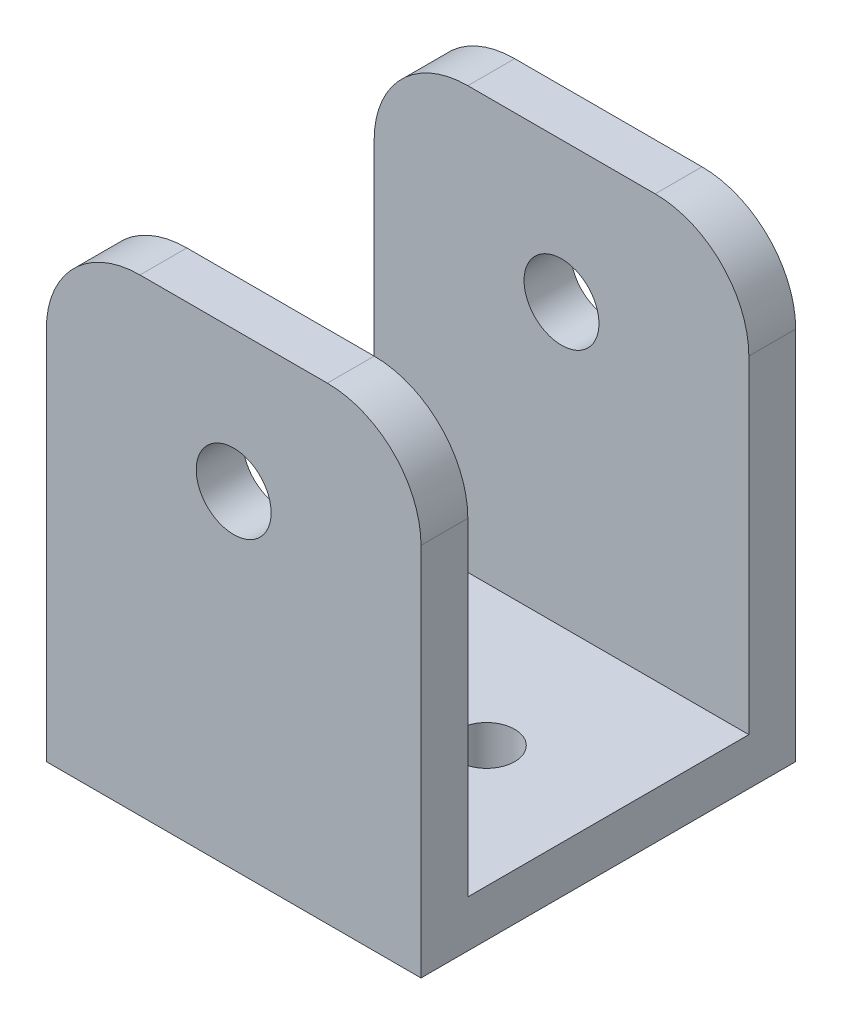
ISO-10303-21;
HEADER;
FILE_DESCRIPTION(('STEP AP214'),'2;1');
FILE_NAME('part.step','',(''),(''),'','','');
FILE_SCHEMA(('AUTOMOTIVE_DESIGN { 1 0 10303 214 1 1 1 1 }'));
ENDSEC;
DATA;
#1=APPLICATION_CONTEXT('core data for automotive mechanical design processes');
#2=APPLICATION_PROTOCOL_DEFINITION('international standard','automotive_design',2000,#1);
#3=PRODUCT_CONTEXT('',#1,'mechanical');
#4=PRODUCT('Part','Part','',(#3));
#5=PRODUCT_RELATED_PRODUCT_CATEGORY('part','',(#4));
#6=PRODUCT_DEFINITION_FORMATION('','',#4);
#7=PRODUCT_DEFINITION_CONTEXT('part definition',#1,'design');
#8=PRODUCT_DEFINITION('design','',#6,#7);
#9=PRODUCT_DEFINITION_SHAPE('','',#8);
#10=(LENGTH_UNIT() NAMED_UNIT(*) SI_UNIT(.MILLI.,.METRE.));
#11=(NAMED_UNIT(*) PLANE_ANGLE_UNIT() SI_UNIT($,.RADIAN.));
#12=(NAMED_UNIT(*) SI_UNIT($,.STERADIAN.) SOLID_ANGLE_UNIT());
#13=UNCERTAINTY_MEASURE_WITH_UNIT(LENGTH_MEASURE(1.E-05),#10,'distance_accuracy_value','');
#14=(GEOMETRIC_REPRESENTATION_CONTEXT(3) GLOBAL_UNCERTAINTY_ASSIGNED_CONTEXT((#13)) GLOBAL_UNIT_ASSIGNED_CONTEXT((#10,
#11,#12)) REPRESENTATION_CONTEXT('',''));
#15=CARTESIAN_POINT('',(0.,0.,0.));
#16=DIRECTION('',(0.,0.,1.));
#17=DIRECTION('',(1.,0.,0.));
#18=AXIS2_PLACEMENT_3D('',#15,#16,#17);
#19=CARTESIAN_POINT('',(-10.,5.,5.));
#20=DIRECTION('',(0.,0.,-1.));
#21=DIRECTION('',(-1.,0.,0.));
#22=AXIS2_PLACEMENT_3D('',#19,#20,#21);
#23=PLANE('',#22);
#24=DIRECTION('',(0.,-1.,0.));
#25=VECTOR('',#24,1.);
#26=CARTESIAN_POINT('',(-20.,-35.,5.));
#27=LINE('',#26,#25);
#28=CARTESIAN_POINT('',(-20.,4.99999999999993,5.));
#29=VERTEX_POINT('',#28);
#30=CARTESIAN_POINT('',(-20.,-35.,5.));
#31=VERTEX_POINT('',#30);
#32=EDGE_CURVE('E134',#29,#31,#27,.T.);
#33=ORIENTED_EDGE('',*,*,#32,.T.);
#34=DIRECTION('',(1.,0.,0.));
#35=VECTOR('',#34,1.);
#36=CARTESIAN_POINT('',(-20.,-35.,5.));
#37=LINE('',#36,#35);
#38=CARTESIAN_POINT('',(20.,-35.,5.));
#39=VERTEX_POINT('',#38);
#40=EDGE_CURVE('E87',#31,#39,#37,.T.);
#41=ORIENTED_EDGE('',*,*,#40,.T.);
#42=DIRECTION('',(0.,1.,0.));
#43=VECTOR('',#42,1.);
#44=CARTESIAN_POINT('',(20.,-35.,5.));
#45=LINE('',#44,#43);
#46=CARTESIAN_POINT('',(20.,4.99999999999993,5.));
#47=VERTEX_POINT('',#46);
#48=EDGE_CURVE('E104',#39,#47,#45,.T.);
#49=ORIENTED_EDGE('',*,*,#48,.T.);
#50=CARTESIAN_POINT('',(10.,5.,5.));
#51=DIRECTION('',(0.,0.,1.));
#52=DIRECTION('',(1.,0.,0.));
#53=AXIS2_PLACEMENT_3D('',#50,#51,#52);
#54=CIRCLE('',#53,10.);
#55=CARTESIAN_POINT('',(9.99999999999993,15.,5.));
#56=VERTEX_POINT('',#55);
#57=EDGE_CURVE('E97',#47,#56,#54,.T.);
#58=ORIENTED_EDGE('',*,*,#57,.T.);
#59=DIRECTION('',(-1.,0.,0.));
#60=VECTOR('',#59,1.);
#61=CARTESIAN_POINT('',(9.99999999999993,15.,5.));
#62=LINE('',#61,#60);
#63=CARTESIAN_POINT('',(-9.99999999999993,15.,5.));
#64=VERTEX_POINT('',#63);
#65=EDGE_CURVE('E101',#56,#64,#62,.T.);
#66=ORIENTED_EDGE('',*,*,#65,.T.);
#67=CARTESIAN_POINT('',(-10.,5.,5.));
#68=DIRECTION('',(0.,0.,1.));
#69=DIRECTION('',(-1.,0.,0.));
#70=AXIS2_PLACEMENT_3D('',#67,#68,#69);
#71=CIRCLE('',#70,10.);
#72=EDGE_CURVE('E58',#64,#29,#71,.T.);
#73=ORIENTED_EDGE('',*,*,#72,.T.);
#74=EDGE_LOOP('',(#33,#41,#49,#58,#66,#73));
#75=FACE_BOUND('',#74,.T.);
#76=CARTESIAN_POINT('',(0.,0.,5.));
#77=DIRECTION('',(0.,0.,1.));
#78=DIRECTION('',(1.,0.,0.));
#79=AXIS2_PLACEMENT_3D('',#76,#77,#78);
#80=CIRCLE('',#79,4.);
#81=CARTESIAN_POINT('',(4.,0.,5.));
#82=VERTEX_POINT('',#81);
#83=EDGE_CURVE('E128',#82,#82,#80,.T.);
#84=ORIENTED_EDGE('',*,*,#83,.F.);
#85=EDGE_LOOP('',(#84));
#86=FACE_BOUND('',#85,.T.);
#87=ADVANCED_FACE('F34',(#75,#86),#23,.F.);
#88=CARTESIAN_POINT('',(-10.,5.,0.));
#89=DIRECTION('',(0.,0.,-1.));
#90=DIRECTION('',(-1.,0.,0.));
#91=AXIS2_PLACEMENT_3D('',#88,#89,#90);
#92=PLANE('',#91);
#93=DIRECTION('',(1.,0.,0.));
#94=VECTOR('',#93,1.);
#95=CARTESIAN_POINT('',(20.,-30.,0.));
#96=LINE('',#95,#94);
#97=CARTESIAN_POINT('',(-20.,-30.,0.));
#98=VERTEX_POINT('',#97);
#99=CARTESIAN_POINT('',(20.,-30.,0.));
#100=VERTEX_POINT('',#99);
#101=EDGE_CURVE('E49',#98,#100,#96,.T.);
#102=ORIENTED_EDGE('',*,*,#101,.F.);
#103=DIRECTION('',(0.,-1.,0.));
#104=VECTOR('',#103,1.);
#105=CARTESIAN_POINT('',(-20.,-35.,0.));
#106=LINE('',#105,#104);
#107=CARTESIAN_POINT('',(-20.,4.99999999999993,0.));
#108=VERTEX_POINT('',#107);
#109=EDGE_CURVE('E125',#108,#98,#106,.T.);
#110=ORIENTED_EDGE('',*,*,#109,.F.);
#111=CARTESIAN_POINT('',(-10.,5.,0.));
#112=DIRECTION('',(0.,0.,1.));
#113=DIRECTION('',(-1.,0.,0.));
#114=AXIS2_PLACEMENT_3D('',#111,#112,#113);
#115=CIRCLE('',#114,10.);
#116=CARTESIAN_POINT('',(-9.99999999999993,15.,0.));
#117=VERTEX_POINT('',#116);
#118=EDGE_CURVE('E79',#117,#108,#115,.T.);
#119=ORIENTED_EDGE('',*,*,#118,.F.);
#120=DIRECTION('',(-1.,0.,0.));
#121=VECTOR('',#120,1.);
#122=CARTESIAN_POINT('',(9.99999999999993,15.,0.));
#123=LINE('',#122,#121);
#124=CARTESIAN_POINT('',(9.99999999999993,15.,0.));
#125=VERTEX_POINT('',#124);
#126=EDGE_CURVE('E131',#125,#117,#123,.T.);
#127=ORIENTED_EDGE('',*,*,#126,.F.);
#128=CARTESIAN_POINT('',(10.,5.,0.));
#129=DIRECTION('',(0.,0.,1.));
#130=DIRECTION('',(1.,0.,0.));
#131=AXIS2_PLACEMENT_3D('',#128,#129,#130);
#132=CIRCLE('',#131,10.);
#133=CARTESIAN_POINT('',(20.,4.99999999999993,0.));
#134=VERTEX_POINT('',#133);
#135=EDGE_CURVE('E113',#134,#125,#132,.T.);
#136=ORIENTED_EDGE('',*,*,#135,.F.);
#137=DIRECTION('',(0.,1.,0.));
#138=VECTOR('',#137,1.);
#139=CARTESIAN_POINT('',(20.,-35.,0.));
#140=LINE('',#139,#138);
#141=EDGE_CURVE('E127',#100,#134,#140,.T.);
#142=ORIENTED_EDGE('',*,*,#141,.F.);
#143=EDGE_LOOP('',(#102,#110,#119,#127,#136,#142));
#144=FACE_BOUND('',#143,.T.);
#145=CARTESIAN_POINT('',(0.,0.,0.));
#146=DIRECTION('',(0.,0.,1.));
#147=DIRECTION('',(1.,0.,0.));
#148=AXIS2_PLACEMENT_3D('',#145,#146,#147);
#149=CIRCLE('',#148,4.);
#150=CARTESIAN_POINT('',(4.,0.,0.));
#151=VERTEX_POINT('',#150);
#152=EDGE_CURVE('E207',#151,#151,#149,.T.);
#153=ORIENTED_EDGE('',*,*,#152,.T.);
#154=EDGE_LOOP('',(#153));
#155=FACE_BOUND('',#154,.T.);
#156=ADVANCED_FACE('F258',(#144,#155),#92,.T.);
#157=CARTESIAN_POINT('',(-20.,-35.,5.));
#158=DIRECTION('',(1.,0.,0.));
#159=DIRECTION('',(0.,0.,-1.));
#160=AXIS2_PLACEMENT_3D('',#157,#158,#159);
#161=PLANE('',#160);
#162=ORIENTED_EDGE('',*,*,#109,.T.);
#163=DIRECTION('',(0.,0.,1.));
#164=VECTOR('',#163,1.);
#165=CARTESIAN_POINT('',(-20.,-30.,-30.));
#166=LINE('',#165,#164);
#167=CARTESIAN_POINT('',(-20.,-30.,-30.));
#168=VERTEX_POINT('',#167);
#169=EDGE_CURVE('E204',#168,#98,#166,.T.);
#170=ORIENTED_EDGE('',*,*,#169,.F.);
#171=DIRECTION('',(0.,1.,0.));
#172=VECTOR('',#171,1.);
#173=CARTESIAN_POINT('',(-20.,0.,-30.));
#174=LINE('',#173,#172);
#175=CARTESIAN_POINT('',(-20.,4.99999999999993,-30.));
#176=VERTEX_POINT('',#175);
#177=EDGE_CURVE('E172',#168,#176,#174,.T.);
#178=ORIENTED_EDGE('',*,*,#177,.T.);
#179=DIRECTION('',(0.,0.,1.));
#180=VECTOR('',#179,1.);
#181=CARTESIAN_POINT('',(-20.,4.99999999999993,-35.));
#182=LINE('',#181,#180);
#183=CARTESIAN_POINT('',(-20.,4.99999999999993,-35.));
#184=VERTEX_POINT('',#183);
#185=EDGE_CURVE('E194',#184,#176,#182,.T.);
#186=ORIENTED_EDGE('',*,*,#185,.F.);
#187=DIRECTION('',(0.,1.,0.));
#188=VECTOR('',#187,1.);
#189=CARTESIAN_POINT('',(-20.,0.,-35.));
#190=LINE('',#189,#188);
#191=CARTESIAN_POINT('',(-20.,-35.,-35.));
#192=VERTEX_POINT('',#191);
#193=EDGE_CURVE('E216',#192,#184,#190,.T.);
#194=ORIENTED_EDGE('',*,*,#193,.F.);
#195=DIRECTION('',(0.,0.,-1.));
#196=VECTOR('',#195,1.);
#197=CARTESIAN_POINT('',(-20.,-35.,5.));
#198=LINE('',#197,#196);
#199=EDGE_CURVE('E11',#31,#192,#198,.T.);
#200=ORIENTED_EDGE('',*,*,#199,.F.);
#201=ORIENTED_EDGE('',*,*,#32,.F.);
#202=DIRECTION('',(0.,0.,-1.));
#203=VECTOR('',#202,1.);
#204=CARTESIAN_POINT('',(-20.,4.99999999999993,5.));
#205=LINE('',#204,#203);
#206=EDGE_CURVE('E121',#29,#108,#205,.T.);
#207=ORIENTED_EDGE('',*,*,#206,.T.);
#208=EDGE_LOOP('',(#162,#170,#178,#186,#194,#200,#201,#207));
#209=FACE_BOUND('',#208,.T.);
#210=ADVANCED_FACE('F36',(#209),#161,.F.);
#211=CARTESIAN_POINT('',(-20.,-35.,5.));
#212=DIRECTION('',(0.,1.,0.));
#213=DIRECTION('',(0.,0.,1.));
#214=AXIS2_PLACEMENT_3D('',#211,#212,#213);
#215=PLANE('',#214);
#216=CARTESIAN_POINT('',(7.,-35.,-15.));
#217=DIRECTION('',(0.,1.,0.));
#218=DIRECTION('',(0.,0.,1.));
#219=AXIS2_PLACEMENT_3D('',#216,#217,#218);
#220=CIRCLE('',#219,3.);
#221=CARTESIAN_POINT('',(7.,-35.,-12.));
#222=VERTEX_POINT('',#221);
#223=EDGE_CURVE('E314',#222,#222,#220,.T.);
#224=ORIENTED_EDGE('',*,*,#223,.T.);
#225=EDGE_LOOP('',(#224));
#226=FACE_BOUND('',#225,.T.);
#227=CARTESIAN_POINT('',(-7.,-35.,-15.));
#228=DIRECTION('',(0.,1.,0.));
#229=DIRECTION('',(0.,0.,1.));
#230=AXIS2_PLACEMENT_3D('',#227,#228,#229);
#231=CIRCLE('',#230,3.);
#232=CARTESIAN_POINT('',(-7.,-35.,-12.));
#233=VERTEX_POINT('',#232);
#234=EDGE_CURVE('E173',#233,#233,#231,.T.);
#235=ORIENTED_EDGE('',*,*,#234,.T.);
#236=EDGE_LOOP('',(#235));
#237=FACE_BOUND('',#236,.T.);
#238=ORIENTED_EDGE('',*,*,#199,.T.);
#239=DIRECTION('',(-1.,0.,0.));
#240=VECTOR('',#239,1.);
#241=CARTESIAN_POINT('',(0.,-35.,-35.));
#242=LINE('',#241,#240);
#243=CARTESIAN_POINT('',(20.,-35.,-35.));
#244=VERTEX_POINT('',#243);
#245=EDGE_CURVE('E154',#244,#192,#242,.T.);
#246=ORIENTED_EDGE('',*,*,#245,.F.);
#247=DIRECTION('',(0.,0.,-1.));
#248=VECTOR('',#247,1.);
#249=CARTESIAN_POINT('',(20.,-35.,5.));
#250=LINE('',#249,#248);
#251=EDGE_CURVE('E42',#39,#244,#250,.T.);
#252=ORIENTED_EDGE('',*,*,#251,.F.);
#253=ORIENTED_EDGE('',*,*,#40,.F.);
#254=EDGE_LOOP('',(#238,#246,#252,#253));
#255=FACE_BOUND('',#254,.T.);
#256=ADVANCED_FACE('F161',(#226,#237,#255),#215,.F.);
#257=CARTESIAN_POINT('',(20.,-35.,5.));
#258=DIRECTION('',(-1.,0.,0.));
#259=DIRECTION('',(0.,0.,1.));
#260=AXIS2_PLACEMENT_3D('',#257,#258,#259);
#261=PLANE('',#260);
#262=ORIENTED_EDGE('',*,*,#251,.T.);
#263=DIRECTION('',(0.,-1.,0.));
#264=VECTOR('',#263,1.);
#265=CARTESIAN_POINT('',(20.,0.,-35.));
#266=LINE('',#265,#264);
#267=CARTESIAN_POINT('',(20.,4.99999999999993,-35.));
#268=VERTEX_POINT('',#267);
#269=EDGE_CURVE('E145',#268,#244,#266,.T.);
#270=ORIENTED_EDGE('',*,*,#269,.F.);
#271=DIRECTION('',(0.,0.,1.));
#272=VECTOR('',#271,1.);
#273=CARTESIAN_POINT('',(20.,4.99999999999993,-35.));
#274=LINE('',#273,#272);
#275=CARTESIAN_POINT('',(20.,4.99999999999993,-30.));
#276=VERTEX_POINT('',#275);
#277=EDGE_CURVE('E163',#268,#276,#274,.T.);
#278=ORIENTED_EDGE('',*,*,#277,.T.);
#279=DIRECTION('',(0.,-1.,0.));
#280=VECTOR('',#279,1.);
#281=CARTESIAN_POINT('',(20.,0.,-30.));
#282=LINE('',#281,#280);
#283=CARTESIAN_POINT('',(20.,-30.,-30.));
#284=VERTEX_POINT('',#283);
#285=EDGE_CURVE('E185',#276,#284,#282,.T.);
#286=ORIENTED_EDGE('',*,*,#285,.T.);
#287=DIRECTION('',(0.,0.,1.));
#288=VECTOR('',#287,1.);
#289=CARTESIAN_POINT('',(20.,-30.,-30.));
#290=LINE('',#289,#288);
#291=EDGE_CURVE('E200',#284,#100,#290,.T.);
#292=ORIENTED_EDGE('',*,*,#291,.T.);
#293=ORIENTED_EDGE('',*,*,#141,.T.);
#294=DIRECTION('',(0.,0.,-1.));
#295=VECTOR('',#294,1.);
#296=CARTESIAN_POINT('',(20.,4.99999999999993,5.));
#297=LINE('',#296,#295);
#298=EDGE_CURVE('E116',#47,#134,#297,.T.);
#299=ORIENTED_EDGE('',*,*,#298,.F.);
#300=ORIENTED_EDGE('',*,*,#48,.F.);
#301=EDGE_LOOP('',(#262,#270,#278,#286,#292,#293,#299,#300));
#302=FACE_BOUND('',#301,.T.);
#303=ADVANCED_FACE('F142',(#302),#261,.F.);
#304=CARTESIAN_POINT('',(10.,5.,5.));
#305=DIRECTION('',(0.,0.,-1.));
#306=DIRECTION('',(-1.,0.,0.));
#307=AXIS2_PLACEMENT_3D('',#304,#305,#306);
#308=CYLINDRICAL_SURFACE('',#307,10.);
#309=ORIENTED_EDGE('',*,*,#135,.T.);
#310=DIRECTION('',(0.,0.,-1.));
#311=VECTOR('',#310,1.);
#312=CARTESIAN_POINT('',(9.99999999999993,15.,5.));
#313=LINE('',#312,#311);
#314=EDGE_CURVE('E110',#56,#125,#313,.T.);
#315=ORIENTED_EDGE('',*,*,#314,.F.);
#316=ORIENTED_EDGE('',*,*,#57,.F.);
#317=ORIENTED_EDGE('',*,*,#298,.T.);
#318=EDGE_LOOP('',(#309,#315,#316,#317));
#319=FACE_BOUND('',#318,.T.);
#320=ADVANCED_FACE('F111',(#319),#308,.T.);
#321=CARTESIAN_POINT('',(9.99999999999993,15.,5.));
#322=DIRECTION('',(0.,-1.,0.));
#323=DIRECTION('',(0.,0.,-1.));
#324=AXIS2_PLACEMENT_3D('',#321,#322,#323);
#325=PLANE('',#324);
#326=ORIENTED_EDGE('',*,*,#126,.T.);
#327=DIRECTION('',(0.,0.,-1.));
#328=VECTOR('',#327,1.);
#329=CARTESIAN_POINT('',(-9.99999999999993,15.,5.));
#330=LINE('',#329,#328);
#331=EDGE_CURVE('E117',#64,#117,#330,.T.);
#332=ORIENTED_EDGE('',*,*,#331,.F.);
#333=ORIENTED_EDGE('',*,*,#65,.F.);
#334=ORIENTED_EDGE('',*,*,#314,.T.);
#335=EDGE_LOOP('',(#326,#332,#333,#334));
#336=FACE_BOUND('',#335,.T.);
#337=ADVANCED_FACE('F119',(#336),#325,.F.);
#338=CARTESIAN_POINT('',(-10.,5.,5.));
#339=DIRECTION('',(0.,0.,-1.));
#340=DIRECTION('',(-1.,0.,0.));
#341=AXIS2_PLACEMENT_3D('',#338,#339,#340);
#342=CYLINDRICAL_SURFACE('',#341,10.);
#343=ORIENTED_EDGE('',*,*,#118,.T.);
#344=ORIENTED_EDGE('',*,*,#206,.F.);
#345=ORIENTED_EDGE('',*,*,#72,.F.);
#346=ORIENTED_EDGE('',*,*,#331,.T.);
#347=EDGE_LOOP('',(#343,#344,#345,#346));
#348=FACE_BOUND('',#347,.T.);
#349=ADVANCED_FACE('F260',(#348),#342,.T.);
#350=CARTESIAN_POINT('',(0.,0.,5.));
#351=DIRECTION('',(0.,0.,-1.));
#352=DIRECTION('',(-1.,0.,0.));
#353=AXIS2_PLACEMENT_3D('',#350,#351,#352);
#354=CYLINDRICAL_SURFACE('',#353,4.);
#355=ORIENTED_EDGE('',*,*,#83,.T.);
#356=EDGE_LOOP('',(#355));
#357=FACE_BOUND('',#356,.T.);
#358=ORIENTED_EDGE('',*,*,#152,.F.);
#359=EDGE_LOOP('',(#358));
#360=FACE_BOUND('',#359,.T.);
#361=ADVANCED_FACE('F262',(#357,#360),#354,.F.);
#362=CARTESIAN_POINT('',(20.,-30.,-30.));
#363=DIRECTION('',(0.,-1.,0.));
#364=DIRECTION('',(0.,0.,-1.));
#365=AXIS2_PLACEMENT_3D('',#362,#363,#364);
#366=PLANE('',#365);
#367=CARTESIAN_POINT('',(7.,-30.,-15.));
#368=DIRECTION('',(0.,1.,0.));
#369=DIRECTION('',(0.,0.,1.));
#370=AXIS2_PLACEMENT_3D('',#367,#368,#369);
#371=CIRCLE('',#370,3.);
#372=CARTESIAN_POINT('',(7.,-30.,-12.));
#373=VERTEX_POINT('',#372);
#374=EDGE_CURVE('E311',#373,#373,#371,.T.);
#375=ORIENTED_EDGE('',*,*,#374,.F.);
#376=EDGE_LOOP('',(#375));
#377=FACE_BOUND('',#376,.T.);
#378=CARTESIAN_POINT('',(-7.,-30.,-15.));
#379=DIRECTION('',(0.,1.,0.));
#380=DIRECTION('',(0.,0.,1.));
#381=AXIS2_PLACEMENT_3D('',#378,#379,#380);
#382=CIRCLE('',#381,3.);
#383=CARTESIAN_POINT('',(-7.,-30.,-12.));
#384=VERTEX_POINT('',#383);
#385=EDGE_CURVE('E316',#384,#384,#382,.T.);
#386=ORIENTED_EDGE('',*,*,#385,.F.);
#387=EDGE_LOOP('',(#386));
#388=FACE_BOUND('',#387,.T.);
#389=ORIENTED_EDGE('',*,*,#101,.T.);
#390=ORIENTED_EDGE('',*,*,#291,.F.);
#391=DIRECTION('',(1.,0.,0.));
#392=VECTOR('',#391,1.);
#393=CARTESIAN_POINT('',(20.,-30.,-30.));
#394=LINE('',#393,#392);
#395=EDGE_CURVE('E197',#168,#284,#394,.T.);
#396=ORIENTED_EDGE('',*,*,#395,.F.);
#397=ORIENTED_EDGE('',*,*,#169,.T.);
#398=EDGE_LOOP('',(#389,#390,#396,#397));
#399=FACE_BOUND('',#398,.T.);
#400=ADVANCED_FACE('F256',(#377,#388,#399),#366,.F.);
#401=CARTESIAN_POINT('',(0.,0.,-30.));
#402=DIRECTION('',(0.,0.,-1.));
#403=DIRECTION('',(-1.,0.,0.));
#404=AXIS2_PLACEMENT_3D('',#401,#402,#403);
#405=PLANE('',#404);
#406=CARTESIAN_POINT('',(0.,0.,-30.));
#407=DIRECTION('',(0.,0.,-1.));
#408=DIRECTION('',(-1.,0.,0.));
#409=AXIS2_PLACEMENT_3D('',#406,#407,#408);
#410=CIRCLE('',#409,4.);
#411=CARTESIAN_POINT('',(-4.,0.,-30.));
#412=VERTEX_POINT('',#411);
#413=EDGE_CURVE('E169',#412,#412,#410,.T.);
#414=ORIENTED_EDGE('',*,*,#413,.T.);
#415=EDGE_LOOP('',(#414));
#416=FACE_BOUND('',#415,.T.);
#417=ORIENTED_EDGE('',*,*,#177,.F.);
#418=ORIENTED_EDGE('',*,*,#395,.T.);
#419=ORIENTED_EDGE('',*,*,#285,.F.);
#420=CARTESIAN_POINT('',(10.,5.,-30.));
#421=DIRECTION('',(0.,0.,-1.));
#422=DIRECTION('',(-1.,0.,0.));
#423=AXIS2_PLACEMENT_3D('',#420,#421,#422);
#424=CIRCLE('',#423,10.);
#425=CARTESIAN_POINT('',(9.99999999999993,15.,-30.));
#426=VERTEX_POINT('',#425);
#427=EDGE_CURVE('E182',#426,#276,#424,.T.);
#428=ORIENTED_EDGE('',*,*,#427,.F.);
#429=DIRECTION('',(1.,0.,0.));
#430=VECTOR('',#429,1.);
#431=CARTESIAN_POINT('',(0.,15.,-30.));
#432=LINE('',#431,#430);
#433=CARTESIAN_POINT('',(-9.99999999999993,15.,-30.));
#434=VERTEX_POINT('',#433);
#435=EDGE_CURVE('E179',#434,#426,#432,.T.);
#436=ORIENTED_EDGE('',*,*,#435,.F.);
#437=CARTESIAN_POINT('',(-10.,5.,-30.));
#438=DIRECTION('',(0.,0.,-1.));
#439=DIRECTION('',(-1.,0.,0.));
#440=AXIS2_PLACEMENT_3D('',#437,#438,#439);
#441=CIRCLE('',#440,10.);
#442=EDGE_CURVE('E176',#176,#434,#441,.T.);
#443=ORIENTED_EDGE('',*,*,#442,.F.);
#444=EDGE_LOOP('',(#417,#418,#419,#428,#436,#443));
#445=FACE_BOUND('',#444,.T.);
#446=ADVANCED_FACE('F249',(#416,#445),#405,.F.);
#447=CARTESIAN_POINT('',(-10.,5.,-35.));
#448=DIRECTION('',(0.,0.,1.));
#449=DIRECTION('',(1.,0.,0.));
#450=AXIS2_PLACEMENT_3D('',#447,#448,#449);
#451=CYLINDRICAL_SURFACE('',#450,10.);
#452=ORIENTED_EDGE('',*,*,#442,.T.);
#453=DIRECTION('',(0.,0.,1.));
#454=VECTOR('',#453,1.);
#455=CARTESIAN_POINT('',(-9.99999999999993,15.,-35.));
#456=LINE('',#455,#454);
#457=CARTESIAN_POINT('',(-9.99999999999993,15.,-35.));
#458=VERTEX_POINT('',#457);
#459=EDGE_CURVE('E191',#458,#434,#456,.T.);
#460=ORIENTED_EDGE('',*,*,#459,.F.);
#461=CARTESIAN_POINT('',(-10.,5.,-35.));
#462=DIRECTION('',(0.,0.,-1.));
#463=DIRECTION('',(-1.,0.,0.));
#464=AXIS2_PLACEMENT_3D('',#461,#462,#463);
#465=CIRCLE('',#464,10.);
#466=EDGE_CURVE('E221',#184,#458,#465,.T.);
#467=ORIENTED_EDGE('',*,*,#466,.F.);
#468=ORIENTED_EDGE('',*,*,#185,.T.);
#469=EDGE_LOOP('',(#452,#460,#467,#468));
#470=FACE_BOUND('',#469,.T.);
#471=ADVANCED_FACE('F285',(#470),#451,.T.);
#472=CARTESIAN_POINT('',(0.,15.,-35.));
#473=DIRECTION('',(0.,-1.,0.));
#474=DIRECTION('',(0.,0.,-1.));
#475=AXIS2_PLACEMENT_3D('',#472,#473,#474);
#476=PLANE('',#475);
#477=ORIENTED_EDGE('',*,*,#435,.T.);
#478=DIRECTION('',(0.,0.,1.));
#479=VECTOR('',#478,1.);
#480=CARTESIAN_POINT('',(9.99999999999993,15.,-35.));
#481=LINE('',#480,#479);
#482=CARTESIAN_POINT('',(9.99999999999993,15.,-35.));
#483=VERTEX_POINT('',#482);
#484=EDGE_CURVE('E165',#483,#426,#481,.T.);
#485=ORIENTED_EDGE('',*,*,#484,.F.);
#486=DIRECTION('',(1.,0.,0.));
#487=VECTOR('',#486,1.);
#488=CARTESIAN_POINT('',(0.,15.,-35.));
#489=LINE('',#488,#487);
#490=EDGE_CURVE('E223',#458,#483,#489,.T.);
#491=ORIENTED_EDGE('',*,*,#490,.F.);
#492=ORIENTED_EDGE('',*,*,#459,.T.);
#493=EDGE_LOOP('',(#477,#485,#491,#492));
#494=FACE_BOUND('',#493,.T.);
#495=ADVANCED_FACE('F237',(#494),#476,.F.);
#496=CARTESIAN_POINT('',(10.,5.,-35.));
#497=DIRECTION('',(0.,0.,1.));
#498=DIRECTION('',(1.,0.,0.));
#499=AXIS2_PLACEMENT_3D('',#496,#497,#498);
#500=CYLINDRICAL_SURFACE('',#499,10.);
#501=ORIENTED_EDGE('',*,*,#427,.T.);
#502=ORIENTED_EDGE('',*,*,#277,.F.);
#503=CARTESIAN_POINT('',(10.,5.,-35.));
#504=DIRECTION('',(0.,0.,-1.));
#505=DIRECTION('',(-1.,0.,0.));
#506=AXIS2_PLACEMENT_3D('',#503,#504,#505);
#507=CIRCLE('',#506,10.);
#508=EDGE_CURVE('E158',#483,#268,#507,.T.);
#509=ORIENTED_EDGE('',*,*,#508,.F.);
#510=ORIENTED_EDGE('',*,*,#484,.T.);
#511=EDGE_LOOP('',(#501,#502,#509,#510));
#512=FACE_BOUND('',#511,.T.);
#513=ADVANCED_FACE('F242',(#512),#500,.T.);
#514=CARTESIAN_POINT('',(0.,0.,-35.));
#515=DIRECTION('',(0.,0.,1.));
#516=DIRECTION('',(1.,0.,0.));
#517=AXIS2_PLACEMENT_3D('',#514,#515,#516);
#518=CYLINDRICAL_SURFACE('',#517,4.);
#519=CARTESIAN_POINT('',(0.,0.,-35.));
#520=DIRECTION('',(0.,0.,-1.));
#521=DIRECTION('',(-1.,0.,0.));
#522=AXIS2_PLACEMENT_3D('',#519,#520,#521);
#523=CIRCLE('',#522,4.);
#524=CARTESIAN_POINT('',(-4.,0.,-35.));
#525=VERTEX_POINT('',#524);
#526=EDGE_CURVE('E187',#525,#525,#523,.T.);
#527=ORIENTED_EDGE('',*,*,#526,.T.);
#528=EDGE_LOOP('',(#527));
#529=FACE_BOUND('',#528,.T.);
#530=ORIENTED_EDGE('',*,*,#413,.F.);
#531=EDGE_LOOP('',(#530));
#532=FACE_BOUND('',#531,.T.);
#533=ADVANCED_FACE('F281',(#529,#532),#518,.F.);
#534=CARTESIAN_POINT('',(0.,0.,-35.));
#535=DIRECTION('',(0.,0.,-1.));
#536=DIRECTION('',(-1.,0.,0.));
#537=AXIS2_PLACEMENT_3D('',#534,#535,#536);
#538=PLANE('',#537);
#539=ORIENTED_EDGE('',*,*,#526,.F.);
#540=EDGE_LOOP('',(#539));
#541=FACE_BOUND('',#540,.T.);
#542=ORIENTED_EDGE('',*,*,#193,.T.);
#543=ORIENTED_EDGE('',*,*,#466,.T.);
#544=ORIENTED_EDGE('',*,*,#490,.T.);
#545=ORIENTED_EDGE('',*,*,#508,.T.);
#546=ORIENTED_EDGE('',*,*,#269,.T.);
#547=ORIENTED_EDGE('',*,*,#245,.T.);
#548=EDGE_LOOP('',(#542,#543,#544,#545,#546,#547));
#549=FACE_BOUND('',#548,.T.);
#550=ADVANCED_FACE('F153',(#541,#549),#538,.T.);
#551=CARTESIAN_POINT('',(-7.,-45.,-15.));
#552=DIRECTION('',(0.,1.,0.));
#553=DIRECTION('',(0.,0.,1.));
#554=AXIS2_PLACEMENT_3D('',#551,#552,#553);
#555=CYLINDRICAL_SURFACE('',#554,3.);
#556=ORIENTED_EDGE('',*,*,#385,.T.);
#557=EDGE_LOOP('',(#556));
#558=FACE_BOUND('',#557,.T.);
#559=ORIENTED_EDGE('',*,*,#234,.F.);
#560=EDGE_LOOP('',(#559));
#561=FACE_BOUND('',#560,.T.);
#562=ADVANCED_FACE('F298',(#558,#561),#555,.F.);
#563=CARTESIAN_POINT('',(7.,-45.,-15.));
#564=DIRECTION('',(0.,1.,0.));
#565=DIRECTION('',(0.,0.,1.));
#566=AXIS2_PLACEMENT_3D('',#563,#564,#565);
#567=CYLINDRICAL_SURFACE('',#566,3.);
#568=ORIENTED_EDGE('',*,*,#374,.T.);
#569=EDGE_LOOP('',(#568));
#570=FACE_BOUND('',#569,.T.);
#571=ORIENTED_EDGE('',*,*,#223,.F.);
#572=EDGE_LOOP('',(#571));
#573=FACE_BOUND('',#572,.T.);
#574=ADVANCED_FACE('F302',(#570,#573),#567,.F.);
#575=CLOSED_SHELL('',(#87,#156,#210,#256,#303,#320,#337,#349,#361,#400,#446,#471,#495,#513,#533,
#550,#562,#574));
#576=MANIFOLD_SOLID_BREP('B2',#575);
#577=ADVANCED_BREP_SHAPE_REPRESENTATION('',(#18,#576),#14);
#578=SHAPE_DEFINITION_REPRESENTATION(#9,#577);
ENDSEC;
END-ISO-10303-21;
